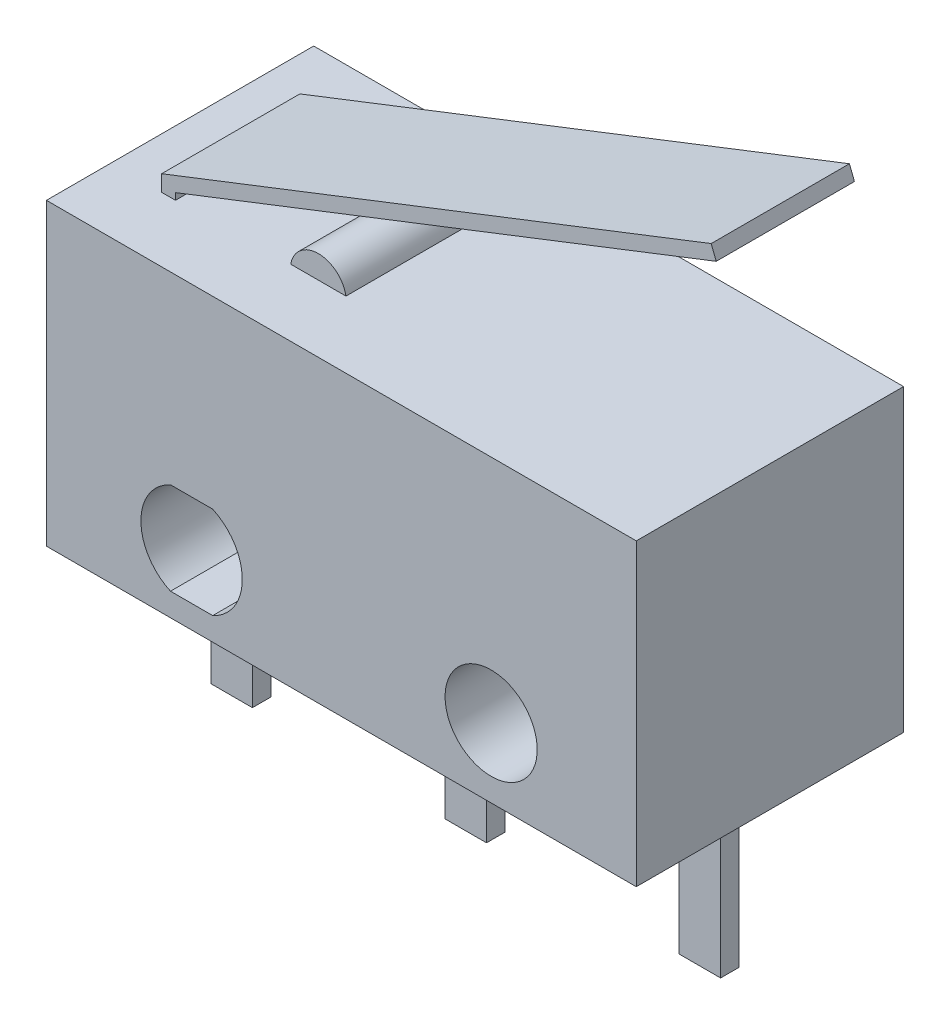
ISO-10303-21;
HEADER;
FILE_DESCRIPTION(('STEP AP214'),'2;1');
FILE_NAME('part.step','',(''),(''),'','','');
FILE_SCHEMA(('AUTOMOTIVE_DESIGN { 1 0 10303 214 1 1 1 1 }'));
ENDSEC;
DATA;
#1=APPLICATION_CONTEXT('core data for automotive mechanical design processes');
#2=APPLICATION_PROTOCOL_DEFINITION('international standard','automotive_design',2000,#1);
#3=PRODUCT_CONTEXT('',#1,'mechanical');
#4=PRODUCT('Part','Part','',(#3));
#5=PRODUCT_RELATED_PRODUCT_CATEGORY('part','',(#4));
#6=PRODUCT_DEFINITION_FORMATION('','',#4);
#7=PRODUCT_DEFINITION_CONTEXT('part definition',#1,'design');
#8=PRODUCT_DEFINITION('design','',#6,#7);
#9=PRODUCT_DEFINITION_SHAPE('','',#8);
#10=(LENGTH_UNIT() NAMED_UNIT(*) SI_UNIT(.MILLI.,.METRE.));
#11=(NAMED_UNIT(*) PLANE_ANGLE_UNIT() SI_UNIT($,.RADIAN.));
#12=(NAMED_UNIT(*) SI_UNIT($,.STERADIAN.) SOLID_ANGLE_UNIT());
#13=UNCERTAINTY_MEASURE_WITH_UNIT(LENGTH_MEASURE(1.E-05),#10,'distance_accuracy_value','');
#14=(GEOMETRIC_REPRESENTATION_CONTEXT(3) GLOBAL_UNCERTAINTY_ASSIGNED_CONTEXT((#13)) GLOBAL_UNIT_ASSIGNED_CONTEXT((#10,
#11,#12)) REPRESENTATION_CONTEXT('',''));
#15=CARTESIAN_POINT('',(0.,0.,0.));
#16=DIRECTION('',(0.,0.,1.));
#17=DIRECTION('',(1.,0.,0.));
#18=AXIS2_PLACEMENT_3D('',#15,#16,#17);
#19=CARTESIAN_POINT('',(6.4,3.25,0.));
#20=DIRECTION('',(-1.,0.,0.));
#21=DIRECTION('',(0.,0.,1.));
#22=AXIS2_PLACEMENT_3D('',#19,#20,#21);
#23=PLANE('',#22);
#24=DIRECTION('',(0.,0.,-1.));
#25=VECTOR('',#24,1.);
#26=CARTESIAN_POINT('',(6.4,0.,0.));
#27=LINE('',#26,#25);
#28=CARTESIAN_POINT('',(6.4,0.,2.9));
#29=VERTEX_POINT('',#28);
#30=CARTESIAN_POINT('',(6.4,0.,-2.9));
#31=VERTEX_POINT('',#30);
#32=EDGE_CURVE('E235',#29,#31,#27,.T.);
#33=ORIENTED_EDGE('',*,*,#32,.T.);
#34=DIRECTION('',(0.,-1.,0.));
#35=VECTOR('',#34,1.);
#36=CARTESIAN_POINT('',(6.4,3.25,-2.9));
#37=LINE('',#36,#35);
#38=CARTESIAN_POINT('',(6.4,6.5,-2.9));
#39=VERTEX_POINT('',#38);
#40=EDGE_CURVE('E231',#39,#31,#37,.T.);
#41=ORIENTED_EDGE('',*,*,#40,.F.);
#42=DIRECTION('',(0.,0.,-1.));
#43=VECTOR('',#42,1.);
#44=CARTESIAN_POINT('',(6.4,6.5,0.));
#45=LINE('',#44,#43);
#46=CARTESIAN_POINT('',(6.4,6.5,2.9));
#47=VERTEX_POINT('',#46);
#48=EDGE_CURVE('E9',#47,#39,#45,.T.);
#49=ORIENTED_EDGE('',*,*,#48,.F.);
#50=DIRECTION('',(0.,1.,0.));
#51=VECTOR('',#50,1.);
#52=CARTESIAN_POINT('',(6.4,3.25,2.9));
#53=LINE('',#52,#51);
#54=EDGE_CURVE('E223',#29,#47,#53,.T.);
#55=ORIENTED_EDGE('',*,*,#54,.F.);
#56=EDGE_LOOP('',(#33,#41,#49,#55));
#57=FACE_BOUND('',#56,.T.);
#58=ADVANCED_FACE('F15',(#57),#23,.F.);
#59=CARTESIAN_POINT('',(0.,6.5,0.));
#60=DIRECTION('',(0.,-1.,0.));
#61=DIRECTION('',(0.,0.,-1.));
#62=AXIS2_PLACEMENT_3D('',#59,#60,#61);
#63=PLANE('',#62);
#64=ORIENTED_EDGE('',*,*,#48,.T.);
#65=DIRECTION('',(1.,0.,0.));
#66=VECTOR('',#65,1.);
#67=CARTESIAN_POINT('',(0.,6.5,-2.9));
#68=LINE('',#67,#66);
#69=CARTESIAN_POINT('',(-6.4,6.5,-2.9));
#70=VERTEX_POINT('',#69);
#71=EDGE_CURVE('E236',#70,#39,#68,.T.);
#72=ORIENTED_EDGE('',*,*,#71,.F.);
#73=DIRECTION('',(0.,0.,-1.));
#74=VECTOR('',#73,1.);
#75=CARTESIAN_POINT('',(-6.4,6.5,0.));
#76=LINE('',#75,#74);
#77=CARTESIAN_POINT('',(-6.4,6.5,2.9));
#78=VERTEX_POINT('',#77);
#79=EDGE_CURVE('E25',#78,#70,#76,.T.);
#80=ORIENTED_EDGE('',*,*,#79,.F.);
#81=DIRECTION('',(-1.,0.,0.));
#82=VECTOR('',#81,1.);
#83=CARTESIAN_POINT('',(0.,6.5,2.9));
#84=LINE('',#83,#82);
#85=EDGE_CURVE('E226',#47,#78,#84,.T.);
#86=ORIENTED_EDGE('',*,*,#85,.F.);
#87=EDGE_LOOP('',(#64,#72,#80,#86));
#88=FACE_BOUND('',#87,.T.);
#89=DIRECTION('',(0.,0.,-1.));
#90=VECTOR('',#89,1.);
#91=CARTESIAN_POINT('',(-5.3000080715871,6.5,-0.75));
#92=LINE('',#91,#90);
#93=CARTESIAN_POINT('',(-5.3000080715871,6.5,1.5));
#94=VERTEX_POINT('',#93);
#95=CARTESIAN_POINT('',(-5.3000080715871,6.5,-1.5));
#96=VERTEX_POINT('',#95);
#97=EDGE_CURVE('E330',#94,#96,#92,.T.);
#98=ORIENTED_EDGE('',*,*,#97,.T.);
#99=DIRECTION('',(1.,0.,0.));
#100=VECTOR('',#99,1.);
#101=CARTESIAN_POINT('',(0.15945017554528,6.5,-1.5));
#102=LINE('',#101,#100);
#103=CARTESIAN_POINT('',(-5.00000406262541,6.5,-1.5));
#104=VERTEX_POINT('',#103);
#105=EDGE_CURVE('E285',#96,#104,#102,.T.);
#106=ORIENTED_EDGE('',*,*,#105,.T.);
#107=DIRECTION('',(0.,0.,1.));
#108=VECTOR('',#107,1.);
#109=CARTESIAN_POINT('',(-5.00000406262541,6.5,-0.75));
#110=LINE('',#109,#108);
#111=CARTESIAN_POINT('',(-5.00000406262541,6.5,1.5));
#112=VERTEX_POINT('',#111);
#113=EDGE_CURVE('E254',#104,#112,#110,.T.);
#114=ORIENTED_EDGE('',*,*,#113,.T.);
#115=DIRECTION('',(-1.,0.,0.));
#116=VECTOR('',#115,1.);
#117=CARTESIAN_POINT('',(0.15945017554528,6.5,1.5));
#118=LINE('',#117,#116);
#119=EDGE_CURVE('E355',#112,#94,#118,.T.);
#120=ORIENTED_EDGE('',*,*,#119,.T.);
#121=EDGE_LOOP('',(#98,#106,#114,#120));
#122=FACE_BOUND('',#121,.T.);
#123=DIRECTION('',(0.,0.,1.));
#124=VECTOR('',#123,1.);
#125=CARTESIAN_POINT('',(-1.35,6.5,0.));
#126=LINE('',#125,#124);
#127=CARTESIAN_POINT('',(-1.35,6.5,-1.45));
#128=VERTEX_POINT('',#127);
#129=CARTESIAN_POINT('',(-1.35,6.5,1.45));
#130=VERTEX_POINT('',#129);
#131=EDGE_CURVE('E296',#128,#130,#126,.T.);
#132=ORIENTED_EDGE('',*,*,#131,.T.);
#133=DIRECTION('',(-1.,0.,0.));
#134=VECTOR('',#133,1.);
#135=CARTESIAN_POINT('',(-0.975,6.5,1.45));
#136=LINE('',#135,#134);
#137=CARTESIAN_POINT('',(-2.55,6.5,1.45));
#138=VERTEX_POINT('',#137);
#139=EDGE_CURVE('E394',#130,#138,#136,.T.);
#140=ORIENTED_EDGE('',*,*,#139,.T.);
#141=DIRECTION('',(0.,0.,-1.));
#142=VECTOR('',#141,1.);
#143=CARTESIAN_POINT('',(-2.55,6.5,0.));
#144=LINE('',#143,#142);
#145=CARTESIAN_POINT('',(-2.55,6.5,-1.45));
#146=VERTEX_POINT('',#145);
#147=EDGE_CURVE('E293',#138,#146,#144,.T.);
#148=ORIENTED_EDGE('',*,*,#147,.T.);
#149=DIRECTION('',(1.,0.,0.));
#150=VECTOR('',#149,1.);
#151=CARTESIAN_POINT('',(-0.975,6.5,-1.45));
#152=LINE('',#151,#150);
#153=EDGE_CURVE('E262',#146,#128,#152,.T.);
#154=ORIENTED_EDGE('',*,*,#153,.T.);
#155=EDGE_LOOP('',(#132,#140,#148,#154));
#156=FACE_BOUND('',#155,.T.);
#157=ADVANCED_FACE('F414',(#88,#122,#156),#63,.F.);
#158=CARTESIAN_POINT('',(-6.4,3.25,0.));
#159=DIRECTION('',(1.,0.,0.));
#160=DIRECTION('',(0.,0.,-1.));
#161=AXIS2_PLACEMENT_3D('',#158,#159,#160);
#162=PLANE('',#161);
#163=ORIENTED_EDGE('',*,*,#79,.T.);
#164=DIRECTION('',(0.,1.,0.));
#165=VECTOR('',#164,1.);
#166=CARTESIAN_POINT('',(-6.4,3.25,-2.9));
#167=LINE('',#166,#165);
#168=CARTESIAN_POINT('',(-6.4,0.,-2.9));
#169=VERTEX_POINT('',#168);
#170=EDGE_CURVE('E273',#169,#70,#167,.T.);
#171=ORIENTED_EDGE('',*,*,#170,.F.);
#172=DIRECTION('',(0.,0.,-1.));
#173=VECTOR('',#172,1.);
#174=CARTESIAN_POINT('',(-6.4,0.,0.));
#175=LINE('',#174,#173);
#176=CARTESIAN_POINT('',(-6.4,0.,2.9));
#177=VERTEX_POINT('',#176);
#178=EDGE_CURVE('E233',#177,#169,#175,.T.);
#179=ORIENTED_EDGE('',*,*,#178,.F.);
#180=DIRECTION('',(0.,-1.,0.));
#181=VECTOR('',#180,1.);
#182=CARTESIAN_POINT('',(-6.4,3.25,2.9));
#183=LINE('',#182,#181);
#184=EDGE_CURVE('E232',#78,#177,#183,.T.);
#185=ORIENTED_EDGE('',*,*,#184,.F.);
#186=EDGE_LOOP('',(#163,#171,#179,#185));
#187=FACE_BOUND('',#186,.T.);
#188=ADVANCED_FACE('F507',(#187),#162,.F.);
#189=CARTESIAN_POINT('',(0.,0.,0.));
#190=DIRECTION('',(0.,1.,0.));
#191=DIRECTION('',(0.,0.,1.));
#192=AXIS2_PLACEMENT_3D('',#189,#190,#191);
#193=PLANE('',#192);
#194=ORIENTED_EDGE('',*,*,#178,.T.);
#195=DIRECTION('',(-1.,0.,0.));
#196=VECTOR('',#195,1.);
#197=CARTESIAN_POINT('',(0.,0.,-2.9));
#198=LINE('',#197,#196);
#199=EDGE_CURVE('E276',#31,#169,#198,.T.);
#200=ORIENTED_EDGE('',*,*,#199,.F.);
#201=ORIENTED_EDGE('',*,*,#32,.F.);
#202=DIRECTION('',(1.,0.,0.));
#203=VECTOR('',#202,1.);
#204=CARTESIAN_POINT('',(0.,0.,2.9));
#205=LINE('',#204,#203);
#206=EDGE_CURVE('E228',#177,#29,#205,.T.);
#207=ORIENTED_EDGE('',*,*,#206,.F.);
#208=EDGE_LOOP('',(#194,#200,#201,#207));
#209=FACE_BOUND('',#208,.T.);
#210=DIRECTION('',(-1.,0.,0.));
#211=VECTOR('',#210,1.);
#212=CARTESIAN_POINT('',(-2.54,0.,-0.2));
#213=LINE('',#212,#211);
#214=CARTESIAN_POINT('',(-4.63,0.,-0.2));
#215=VERTEX_POINT('',#214);
#216=CARTESIAN_POINT('',(-5.53,0.,-0.2));
#217=VERTEX_POINT('',#216);
#218=EDGE_CURVE('E202',#215,#217,#213,.T.);
#219=ORIENTED_EDGE('',*,*,#218,.T.);
#220=DIRECTION('',(0.,0.,1.));
#221=VECTOR('',#220,1.);
#222=CARTESIAN_POINT('',(-5.53,0.,0.));
#223=LINE('',#222,#221);
#224=CARTESIAN_POINT('',(-5.53,0.,0.2));
#225=VERTEX_POINT('',#224);
#226=EDGE_CURVE('E463',#217,#225,#223,.T.);
#227=ORIENTED_EDGE('',*,*,#226,.T.);
#228=DIRECTION('',(1.,0.,0.));
#229=VECTOR('',#228,1.);
#230=CARTESIAN_POINT('',(-2.54,0.,0.2));
#231=LINE('',#230,#229);
#232=CARTESIAN_POINT('',(-4.63,0.,0.2));
#233=VERTEX_POINT('',#232);
#234=EDGE_CURVE('E345',#225,#233,#231,.T.);
#235=ORIENTED_EDGE('',*,*,#234,.T.);
#236=DIRECTION('',(0.,0.,-1.));
#237=VECTOR('',#236,1.);
#238=CARTESIAN_POINT('',(-4.63,0.,0.));
#239=LINE('',#238,#237);
#240=EDGE_CURVE('E282',#233,#215,#239,.T.);
#241=ORIENTED_EDGE('',*,*,#240,.T.);
#242=EDGE_LOOP('',(#219,#227,#235,#241));
#243=FACE_BOUND('',#242,.T.);
#244=DIRECTION('',(-1.,0.,0.));
#245=VECTOR('',#244,1.);
#246=CARTESIAN_POINT('',(0.,0.,-0.2));
#247=LINE('',#246,#245);
#248=CARTESIAN_POINT('',(0.45,0.,-0.2));
#249=VERTEX_POINT('',#248);
#250=CARTESIAN_POINT('',(-0.45,0.,-0.2));
#251=VERTEX_POINT('',#250);
#252=EDGE_CURVE('E311',#249,#251,#247,.T.);
#253=ORIENTED_EDGE('',*,*,#252,.T.);
#254=DIRECTION('',(0.,0.,1.));
#255=VECTOR('',#254,1.);
#256=CARTESIAN_POINT('',(-0.45,0.,0.));
#257=LINE('',#256,#255);
#258=CARTESIAN_POINT('',(-0.45,0.,0.2));
#259=VERTEX_POINT('',#258);
#260=EDGE_CURVE('E217',#251,#259,#257,.T.);
#261=ORIENTED_EDGE('',*,*,#260,.T.);
#262=DIRECTION('',(1.,0.,0.));
#263=VECTOR('',#262,1.);
#264=CARTESIAN_POINT('',(0.,0.,0.2));
#265=LINE('',#264,#263);
#266=CARTESIAN_POINT('',(0.45,0.,0.2));
#267=VERTEX_POINT('',#266);
#268=EDGE_CURVE('E314',#259,#267,#265,.T.);
#269=ORIENTED_EDGE('',*,*,#268,.T.);
#270=DIRECTION('',(0.,0.,-1.));
#271=VECTOR('',#270,1.);
#272=CARTESIAN_POINT('',(0.45,0.,0.));
#273=LINE('',#272,#271);
#274=EDGE_CURVE('E19',#267,#249,#273,.T.);
#275=ORIENTED_EDGE('',*,*,#274,.T.);
#276=EDGE_LOOP('',(#253,#261,#269,#275));
#277=FACE_BOUND('',#276,.T.);
#278=DIRECTION('',(-1.,0.,0.));
#279=VECTOR('',#278,1.);
#280=CARTESIAN_POINT('',(2.54,0.,-0.2));
#281=LINE('',#280,#279);
#282=CARTESIAN_POINT('',(5.53,0.,-0.2));
#283=VERTEX_POINT('',#282);
#284=CARTESIAN_POINT('',(4.63,0.,-0.2));
#285=VERTEX_POINT('',#284);
#286=EDGE_CURVE('E195',#283,#285,#281,.T.);
#287=ORIENTED_EDGE('',*,*,#286,.T.);
#288=DIRECTION('',(0.,0.,1.));
#289=VECTOR('',#288,1.);
#290=CARTESIAN_POINT('',(4.63,0.,0.));
#291=LINE('',#290,#289);
#292=CARTESIAN_POINT('',(4.63,0.,0.2));
#293=VERTEX_POINT('',#292);
#294=EDGE_CURVE('E264',#285,#293,#291,.T.);
#295=ORIENTED_EDGE('',*,*,#294,.T.);
#296=DIRECTION('',(1.,0.,0.));
#297=VECTOR('',#296,1.);
#298=CARTESIAN_POINT('',(2.54,0.,0.2));
#299=LINE('',#298,#297);
#300=CARTESIAN_POINT('',(5.53,0.,0.2));
#301=VERTEX_POINT('',#300);
#302=EDGE_CURVE('E192',#293,#301,#299,.T.);
#303=ORIENTED_EDGE('',*,*,#302,.T.);
#304=DIRECTION('',(0.,0.,-1.));
#305=VECTOR('',#304,1.);
#306=CARTESIAN_POINT('',(5.53,0.,0.));
#307=LINE('',#306,#305);
#308=EDGE_CURVE('E182',#301,#283,#307,.T.);
#309=ORIENTED_EDGE('',*,*,#308,.T.);
#310=EDGE_LOOP('',(#287,#295,#303,#309));
#311=FACE_BOUND('',#310,.T.);
#312=ADVANCED_FACE('F447',(#209,#243,#277,#311),#193,.F.);
#313=CARTESIAN_POINT('',(0.,3.25,-2.9));
#314=DIRECTION('',(0.,0.,1.));
#315=DIRECTION('',(1.,0.,0.));
#316=AXIS2_PLACEMENT_3D('',#313,#314,#315);
#317=PLANE('',#316);
#318=ORIENTED_EDGE('',*,*,#40,.T.);
#319=ORIENTED_EDGE('',*,*,#199,.T.);
#320=ORIENTED_EDGE('',*,*,#170,.T.);
#321=ORIENTED_EDGE('',*,*,#71,.T.);
#322=EDGE_LOOP('',(#318,#319,#320,#321));
#323=FACE_BOUND('',#322,.T.);
#324=CARTESIAN_POINT('',(3.25,1.5,-2.9));
#325=DIRECTION('',(0.,0.,1.));
#326=DIRECTION('',(1.,0.,0.));
#327=AXIS2_PLACEMENT_3D('',#324,#325,#326);
#328=CIRCLE('',#327,1.);
#329=CARTESIAN_POINT('',(2.25,1.5,-2.9));
#330=VERTEX_POINT('',#329);
#331=EDGE_CURVE('E343',#330,#330,#328,.T.);
#332=ORIENTED_EDGE('',*,*,#331,.T.);
#333=EDGE_LOOP('',(#332));
#334=FACE_BOUND('',#333,.T.);
#335=DIRECTION('',(-1.,0.,0.));
#336=VECTOR('',#335,1.);
#337=CARTESIAN_POINT('',(-1.25,2.5,-2.9));
#338=LINE('',#337,#336);
#339=CARTESIAN_POINT('',(-2.79174243050441,2.5,-2.9));
#340=VERTEX_POINT('',#339);
#341=CARTESIAN_POINT('',(-3.70825756949558,2.5,-2.9));
#342=VERTEX_POINT('',#341);
#343=EDGE_CURVE('E303',#340,#342,#338,.T.);
#344=ORIENTED_EDGE('',*,*,#343,.T.);
#345=CARTESIAN_POINT('',(-3.25,1.5,-2.9));
#346=DIRECTION('',(0.,0.,1.));
#347=DIRECTION('',(1.,0.,0.));
#348=AXIS2_PLACEMENT_3D('',#345,#346,#347);
#349=CIRCLE('',#348,1.1);
#350=CARTESIAN_POINT('',(-3.70825756949558,0.5,-2.9));
#351=VERTEX_POINT('',#350);
#352=EDGE_CURVE('E268',#342,#351,#349,.T.);
#353=ORIENTED_EDGE('',*,*,#352,.T.);
#354=DIRECTION('',(1.,0.,0.));
#355=VECTOR('',#354,1.);
#356=CARTESIAN_POINT('',(-1.25,0.5,-2.9));
#357=LINE('',#356,#355);
#358=CARTESIAN_POINT('',(-2.79174243050441,0.5,-2.9));
#359=VERTEX_POINT('',#358);
#360=EDGE_CURVE('E221',#351,#359,#357,.T.);
#361=ORIENTED_EDGE('',*,*,#360,.T.);
#362=CARTESIAN_POINT('',(-3.25,1.5,-2.9));
#363=DIRECTION('',(0.,0.,1.));
#364=DIRECTION('',(1.,0.,0.));
#365=AXIS2_PLACEMENT_3D('',#362,#363,#364);
#366=CIRCLE('',#365,1.1);
#367=EDGE_CURVE('E257',#359,#340,#366,.T.);
#368=ORIENTED_EDGE('',*,*,#367,.T.);
#369=EDGE_LOOP('',(#344,#353,#361,#368));
#370=FACE_BOUND('',#369,.T.);
#371=ADVANCED_FACE('F384',(#323,#334,#370),#317,.F.);
#372=CARTESIAN_POINT('',(0.,3.25,2.9));
#373=DIRECTION('',(0.,0.,1.));
#374=DIRECTION('',(1.,0.,0.));
#375=AXIS2_PLACEMENT_3D('',#372,#373,#374);
#376=PLANE('',#375);
#377=ORIENTED_EDGE('',*,*,#54,.T.);
#378=ORIENTED_EDGE('',*,*,#85,.T.);
#379=ORIENTED_EDGE('',*,*,#184,.T.);
#380=ORIENTED_EDGE('',*,*,#206,.T.);
#381=EDGE_LOOP('',(#377,#378,#379,#380));
#382=FACE_BOUND('',#381,.T.);
#383=CARTESIAN_POINT('',(3.25,1.5,2.9));
#384=DIRECTION('',(0.,0.,-1.));
#385=DIRECTION('',(1.,0.,0.));
#386=AXIS2_PLACEMENT_3D('',#383,#384,#385);
#387=CIRCLE('',#386,1.);
#388=CARTESIAN_POINT('',(2.25,1.5,2.9));
#389=VERTEX_POINT('',#388);
#390=EDGE_CURVE('E227',#389,#389,#387,.T.);
#391=ORIENTED_EDGE('',*,*,#390,.T.);
#392=EDGE_LOOP('',(#391));
#393=FACE_BOUND('',#392,.T.);
#394=DIRECTION('',(1.,0.,0.));
#395=VECTOR('',#394,1.);
#396=CARTESIAN_POINT('',(-1.25,2.5,2.9));
#397=LINE('',#396,#395);
#398=CARTESIAN_POINT('',(-3.70825756949558,2.5,2.9));
#399=VERTEX_POINT('',#398);
#400=CARTESIAN_POINT('',(-2.79174243050441,2.5,2.9));
#401=VERTEX_POINT('',#400);
#402=EDGE_CURVE('E305',#399,#401,#397,.T.);
#403=ORIENTED_EDGE('',*,*,#402,.T.);
#404=CARTESIAN_POINT('',(-3.25,1.5,2.9));
#405=DIRECTION('',(0.,0.,-1.));
#406=DIRECTION('',(1.,0.,0.));
#407=AXIS2_PLACEMENT_3D('',#404,#405,#406);
#408=CIRCLE('',#407,1.1);
#409=CARTESIAN_POINT('',(-2.79174243050441,0.5,2.9));
#410=VERTEX_POINT('',#409);
#411=EDGE_CURVE('E255',#401,#410,#408,.T.);
#412=ORIENTED_EDGE('',*,*,#411,.T.);
#413=DIRECTION('',(-1.,0.,0.));
#414=VECTOR('',#413,1.);
#415=CARTESIAN_POINT('',(-1.25,0.5,2.9));
#416=LINE('',#415,#414);
#417=CARTESIAN_POINT('',(-3.70825756949558,0.5,2.9));
#418=VERTEX_POINT('',#417);
#419=EDGE_CURVE('E222',#410,#418,#416,.T.);
#420=ORIENTED_EDGE('',*,*,#419,.T.);
#421=CARTESIAN_POINT('',(-3.25,1.5,2.9));
#422=DIRECTION('',(0.,0.,-1.));
#423=DIRECTION('',(1.,0.,0.));
#424=AXIS2_PLACEMENT_3D('',#421,#422,#423);
#425=CIRCLE('',#424,1.1);
#426=EDGE_CURVE('E272',#418,#399,#425,.T.);
#427=ORIENTED_EDGE('',*,*,#426,.T.);
#428=EDGE_LOOP('',(#403,#412,#420,#427));
#429=FACE_BOUND('',#428,.T.);
#430=ADVANCED_FACE('F541',(#382,#393,#429),#376,.T.);
#431=CARTESIAN_POINT('',(3.25,1.5,0.));
#432=DIRECTION('',(0.,0.,-1.));
#433=DIRECTION('',(1.,0.,0.));
#434=AXIS2_PLACEMENT_3D('',#431,#432,#433);
#435=CYLINDRICAL_SURFACE('',#434,1.);
#436=ORIENTED_EDGE('',*,*,#390,.F.);
#437=EDGE_LOOP('',(#436));
#438=FACE_BOUND('',#437,.T.);
#439=ORIENTED_EDGE('',*,*,#331,.F.);
#440=EDGE_LOOP('',(#439));
#441=FACE_BOUND('',#440,.T.);
#442=ADVANCED_FACE('F526',(#438,#441),#435,.F.);
#443=CARTESIAN_POINT('',(-3.25,1.5,0.));
#444=DIRECTION('',(0.,0.,-1.));
#445=DIRECTION('',(1.,0.,0.));
#446=AXIS2_PLACEMENT_3D('',#443,#444,#445);
#447=CYLINDRICAL_SURFACE('',#446,1.1);
#448=ORIENTED_EDGE('',*,*,#411,.F.);
#449=DIRECTION('',(0.,0.,-1.));
#450=VECTOR('',#449,1.);
#451=CARTESIAN_POINT('',(-2.79174243050441,2.5,0.));
#452=LINE('',#451,#450);
#453=EDGE_CURVE('E258',#401,#340,#452,.T.);
#454=ORIENTED_EDGE('',*,*,#453,.T.);
#455=ORIENTED_EDGE('',*,*,#367,.F.);
#456=DIRECTION('',(0.,0.,1.));
#457=VECTOR('',#456,1.);
#458=CARTESIAN_POINT('',(-2.79174243050441,0.5,0.));
#459=LINE('',#458,#457);
#460=EDGE_CURVE('E218',#359,#410,#459,.T.);
#461=ORIENTED_EDGE('',*,*,#460,.T.);
#462=EDGE_LOOP('',(#448,#454,#455,#461));
#463=FACE_BOUND('',#462,.T.);
#464=ADVANCED_FACE('F377',(#463),#447,.F.);
#465=CARTESIAN_POINT('',(-2.5,2.5,0.));
#466=DIRECTION('',(0.,-1.,0.));
#467=DIRECTION('',(0.,0.,-1.));
#468=AXIS2_PLACEMENT_3D('',#465,#466,#467);
#469=PLANE('',#468);
#470=ORIENTED_EDGE('',*,*,#402,.F.);
#471=DIRECTION('',(0.,0.,1.));
#472=VECTOR('',#471,1.);
#473=CARTESIAN_POINT('',(-3.70825756949558,2.5,0.));
#474=LINE('',#473,#472);
#475=EDGE_CURVE('E271',#342,#399,#474,.T.);
#476=ORIENTED_EDGE('',*,*,#475,.F.);
#477=ORIENTED_EDGE('',*,*,#343,.F.);
#478=ORIENTED_EDGE('',*,*,#453,.F.);
#479=EDGE_LOOP('',(#470,#476,#477,#478));
#480=FACE_BOUND('',#479,.T.);
#481=ADVANCED_FACE('F381',(#480),#469,.T.);
#482=CARTESIAN_POINT('',(-3.25,1.5,0.));
#483=DIRECTION('',(0.,0.,-1.));
#484=DIRECTION('',(1.,0.,0.));
#485=AXIS2_PLACEMENT_3D('',#482,#483,#484);
#486=CYLINDRICAL_SURFACE('',#485,1.1);
#487=ORIENTED_EDGE('',*,*,#426,.F.);
#488=DIRECTION('',(0.,0.,-1.));
#489=VECTOR('',#488,1.);
#490=CARTESIAN_POINT('',(-3.70825756949558,0.5,0.));
#491=LINE('',#490,#489);
#492=EDGE_CURVE('E326',#418,#351,#491,.T.);
#493=ORIENTED_EDGE('',*,*,#492,.T.);
#494=ORIENTED_EDGE('',*,*,#352,.F.);
#495=ORIENTED_EDGE('',*,*,#475,.T.);
#496=EDGE_LOOP('',(#487,#493,#494,#495));
#497=FACE_BOUND('',#496,.T.);
#498=ADVANCED_FACE('F573',(#497),#486,.F.);
#499=CARTESIAN_POINT('',(-2.5,0.5,0.));
#500=DIRECTION('',(0.,1.,0.));
#501=DIRECTION('',(0.,0.,1.));
#502=AXIS2_PLACEMENT_3D('',#499,#500,#501);
#503=PLANE('',#502);
#504=ORIENTED_EDGE('',*,*,#419,.F.);
#505=ORIENTED_EDGE('',*,*,#460,.F.);
#506=ORIENTED_EDGE('',*,*,#360,.F.);
#507=ORIENTED_EDGE('',*,*,#492,.F.);
#508=EDGE_LOOP('',(#504,#505,#506,#507));
#509=FACE_BOUND('',#508,.T.);
#510=ADVANCED_FACE('F571',(#509),#503,.T.);
#511=CARTESIAN_POINT('',(0.31890035109056,8.83100159039961,1.5));
#512=DIRECTION('',(0.,0.,1.));
#513=DIRECTION('',(1.,0.,0.));
#514=AXIS2_PLACEMENT_3D('',#511,#512,#513);
#515=PLANE('',#514);
#516=ORIENTED_EDGE('',*,*,#119,.F.);
#517=DIRECTION('',(5.0282527014689E-06,-0.999999999987358,0.));
#518=VECTOR('',#517,1.);
#519=CARTESIAN_POINT('',(-5.00000479157131,6.64497002303335,1.5));
#520=LINE('',#519,#518);
#521=CARTESIAN_POINT('',(-5.00000479157131,6.64497002303335,1.5));
#522=VERTEX_POINT('',#521);
#523=EDGE_CURVE('E253',#522,#112,#520,.T.);
#524=ORIENTED_EDGE('',*,*,#523,.F.);
#525=DIRECTION('',(-0.931679220841708,-0.363282024674752,0.));
#526=VECTOR('',#525,1.);
#527=CARTESIAN_POINT('',(-5.00000479157131,6.64497002303335,1.5));
#528=LINE('',#527,#526);
#529=CARTESIAN_POINT('',(6.73446706608689,11.2204962337475,1.5));
#530=VERTEX_POINT('',#529);
#531=EDGE_CURVE('E357',#530,#522,#528,.T.);
#532=ORIENTED_EDGE('',*,*,#531,.F.);
#533=DIRECTION('',(0.363282024674744,-0.931679220841711,0.));
#534=VECTOR('',#533,1.);
#535=CARTESIAN_POINT('',(6.73446706608689,11.2204962337475,1.5));
#536=LINE('',#535,#534);
#537=CARTESIAN_POINT('',(6.62548245868447,11.5,1.5));
#538=VERTEX_POINT('',#537);
#539=EDGE_CURVE('E298',#538,#530,#536,.T.);
#540=ORIENTED_EDGE('',*,*,#539,.F.);
#541=DIRECTION('',(0.931679220841709,0.36328202467475,0.));
#542=VECTOR('',#541,1.);
#543=CARTESIAN_POINT('',(-5.30001156808936,6.84999008416321,1.5));
#544=LINE('',#543,#542);
#545=CARTESIAN_POINT('',(-5.30001156808936,6.84999008416321,1.5));
#546=VERTEX_POINT('',#545);
#547=EDGE_CURVE('E261',#546,#538,#544,.T.);
#548=ORIENTED_EDGE('',*,*,#547,.F.);
#549=DIRECTION('',(-9.99028949325345E-06,0.999999999950097,0.));
#550=VECTOR('',#549,1.);
#551=CARTESIAN_POINT('',(-5.30001156808936,6.84999008416321,1.5));
#552=LINE('',#551,#550);
#553=EDGE_CURVE('E292',#94,#546,#552,.T.);
#554=ORIENTED_EDGE('',*,*,#553,.F.);
#555=EDGE_LOOP('',(#516,#524,#532,#540,#548,#554));
#556=FACE_BOUND('',#555,.T.);
#557=ADVANCED_FACE('F426',(#556),#515,.T.);
#558=CARTESIAN_POINT('',(0.867231137257791,8.93273312839043,-1.5));
#559=DIRECTION('',(0.363282024674752,-0.931679220841709,0.));
#560=DIRECTION('',(0.931679220841709,0.363282024674752,0.));
#561=AXIS2_PLACEMENT_3D('',#558,#559,#560);
#562=PLANE('',#561);
#563=ORIENTED_EDGE('',*,*,#531,.T.);
#564=DIRECTION('',(0.,0.,1.));
#565=VECTOR('',#564,1.);
#566=CARTESIAN_POINT('',(-5.00000479157131,6.64497002303335,-1.5));
#567=LINE('',#566,#565);
#568=CARTESIAN_POINT('',(-5.00000479157131,6.64497002303335,-1.5));
#569=VERTEX_POINT('',#568);
#570=EDGE_CURVE('E250',#569,#522,#567,.T.);
#571=ORIENTED_EDGE('',*,*,#570,.F.);
#572=DIRECTION('',(0.931679220841708,0.363282024674752,0.));
#573=VECTOR('',#572,1.);
#574=CARTESIAN_POINT('',(-5.00000479157131,6.64497002303335,-1.5));
#575=LINE('',#574,#573);
#576=CARTESIAN_POINT('',(6.73446706608689,11.2204962337475,-1.5));
#577=VERTEX_POINT('',#576);
#578=EDGE_CURVE('E320',#569,#577,#575,.T.);
#579=ORIENTED_EDGE('',*,*,#578,.T.);
#580=DIRECTION('',(0.,0.,1.));
#581=VECTOR('',#580,1.);
#582=CARTESIAN_POINT('',(6.73446706608689,11.2204962337475,-1.5));
#583=LINE('',#582,#581);
#584=EDGE_CURVE('E301',#577,#530,#583,.T.);
#585=ORIENTED_EDGE('',*,*,#584,.T.);
#586=EDGE_LOOP('',(#563,#571,#579,#585));
#587=FACE_BOUND('',#586,.T.);
#588=ADVANCED_FACE('F569',(#587),#562,.T.);
#589=CARTESIAN_POINT('',(6.67997476238568,11.3602481168737,-1.5));
#590=DIRECTION('',(0.931679220841711,0.363282024674744,0.));
#591=DIRECTION('',(-0.363282024674744,0.931679220841711,0.));
#592=AXIS2_PLACEMENT_3D('',#589,#590,#591);
#593=PLANE('',#592);
#594=ORIENTED_EDGE('',*,*,#539,.T.);
#595=ORIENTED_EDGE('',*,*,#584,.F.);
#596=DIRECTION('',(-0.363282024674744,0.931679220841711,0.));
#597=VECTOR('',#596,1.);
#598=CARTESIAN_POINT('',(6.73446706608689,11.2204962337475,-1.5));
#599=LINE('',#598,#597);
#600=CARTESIAN_POINT('',(6.62548245868447,11.5,-1.5));
#601=VERTEX_POINT('',#600);
#602=EDGE_CURVE('E240',#577,#601,#599,.T.);
#603=ORIENTED_EDGE('',*,*,#602,.T.);
#604=DIRECTION('',(0.,0.,1.));
#605=VECTOR('',#604,1.);
#606=CARTESIAN_POINT('',(6.62548245868447,11.5,-1.5));
#607=LINE('',#606,#605);
#608=EDGE_CURVE('E302',#601,#538,#607,.T.);
#609=ORIENTED_EDGE('',*,*,#608,.T.);
#610=EDGE_LOOP('',(#594,#595,#603,#609));
#611=FACE_BOUND('',#610,.T.);
#612=ADVANCED_FACE('F516',(#611),#593,.T.);
#613=CARTESIAN_POINT('',(0.662735445297558,9.17499504208161,-1.5));
#614=DIRECTION('',(-0.36328202467475,0.931679220841709,0.));
#615=DIRECTION('',(-0.931679220841709,-0.36328202467475,0.));
#616=AXIS2_PLACEMENT_3D('',#613,#614,#615);
#617=PLANE('',#616);
#618=ORIENTED_EDGE('',*,*,#547,.T.);
#619=ORIENTED_EDGE('',*,*,#608,.F.);
#620=DIRECTION('',(0.931679220841709,0.36328202467475,0.));
#621=VECTOR('',#620,1.);
#622=CARTESIAN_POINT('',(-5.30001156808936,6.84999008416321,-1.5));
#623=LINE('',#622,#621);
#624=CARTESIAN_POINT('',(-5.30001156808936,6.84999008416321,-1.5));
#625=VERTEX_POINT('',#624);
#626=EDGE_CURVE('E237',#625,#601,#623,.T.);
#627=ORIENTED_EDGE('',*,*,#626,.F.);
#628=DIRECTION('',(0.,0.,1.));
#629=VECTOR('',#628,1.);
#630=CARTESIAN_POINT('',(-5.30001156808936,6.84999008416321,-1.5));
#631=LINE('',#630,#629);
#632=EDGE_CURVE('E289',#625,#546,#631,.T.);
#633=ORIENTED_EDGE('',*,*,#632,.T.);
#634=EDGE_LOOP('',(#618,#619,#627,#633));
#635=FACE_BOUND('',#634,.T.);
#636=ADVANCED_FACE('F513',(#635),#617,.T.);
#637=CARTESIAN_POINT('',(-5.00000239578569,6.16850518111711,-1.5));
#638=DIRECTION('',(0.999999999987358,5.0282527014689E-06,0.));
#639=DIRECTION('',(-5.0282527014689E-06,0.999999999987358,0.));
#640=AXIS2_PLACEMENT_3D('',#637,#638,#639);
#641=PLANE('',#640);
#642=ORIENTED_EDGE('',*,*,#113,.F.);
#643=DIRECTION('',(5.0282527014689E-06,-0.999999999987358,0.));
#644=VECTOR('',#643,1.);
#645=CARTESIAN_POINT('',(-5.00000479157131,6.64497002303335,-1.5));
#646=LINE('',#645,#644);
#647=EDGE_CURVE('E323',#569,#104,#646,.T.);
#648=ORIENTED_EDGE('',*,*,#647,.F.);
#649=ORIENTED_EDGE('',*,*,#570,.T.);
#650=ORIENTED_EDGE('',*,*,#523,.T.);
#651=EDGE_LOOP('',(#642,#648,#649,#650));
#652=FACE_BOUND('',#651,.T.);
#653=ADVANCED_FACE('F423',(#652),#641,.T.);
#654=CARTESIAN_POINT('',(-5.30000578396277,6.27101521168204,-1.5));
#655=DIRECTION('',(-0.999999999950097,-9.99028949325345E-06,0.));
#656=DIRECTION('',(9.99028949325345E-06,-0.999999999950097,0.));
#657=AXIS2_PLACEMENT_3D('',#654,#655,#656);
#658=PLANE('',#657);
#659=ORIENTED_EDGE('',*,*,#97,.F.);
#660=ORIENTED_EDGE('',*,*,#553,.T.);
#661=ORIENTED_EDGE('',*,*,#632,.F.);
#662=DIRECTION('',(9.99028949325345E-06,-0.999999999950097,0.));
#663=VECTOR('',#662,1.);
#664=CARTESIAN_POINT('',(-5.30001156808936,6.84999008416321,-1.5));
#665=LINE('',#664,#663);
#666=EDGE_CURVE('E241',#625,#96,#665,.T.);
#667=ORIENTED_EDGE('',*,*,#666,.T.);
#668=EDGE_LOOP('',(#659,#660,#661,#667));
#669=FACE_BOUND('',#668,.T.);
#670=ADVANCED_FACE('F518',(#669),#658,.T.);
#671=CARTESIAN_POINT('',(0.31890035109056,8.83100159039961,-1.5));
#672=DIRECTION('',(0.,0.,1.));
#673=DIRECTION('',(1.,0.,0.));
#674=AXIS2_PLACEMENT_3D('',#671,#672,#673);
#675=PLANE('',#674);
#676=ORIENTED_EDGE('',*,*,#105,.F.);
#677=ORIENTED_EDGE('',*,*,#666,.F.);
#678=ORIENTED_EDGE('',*,*,#626,.T.);
#679=ORIENTED_EDGE('',*,*,#602,.F.);
#680=ORIENTED_EDGE('',*,*,#578,.F.);
#681=ORIENTED_EDGE('',*,*,#647,.T.);
#682=EDGE_LOOP('',(#676,#677,#678,#679,#680,#681));
#683=FACE_BOUND('',#682,.T.);
#684=ADVANCED_FACE('F17',(#683),#675,.F.);
#685=CARTESIAN_POINT('',(-4.63,-1.5,0.));
#686=DIRECTION('',(-1.,0.,0.));
#687=DIRECTION('',(0.,0.,1.));
#688=AXIS2_PLACEMENT_3D('',#685,#686,#687);
#689=PLANE('',#688);
#690=ORIENTED_EDGE('',*,*,#240,.F.);
#691=DIRECTION('',(0.,1.,0.));
#692=VECTOR('',#691,1.);
#693=CARTESIAN_POINT('',(-4.63,-1.5,0.2));
#694=LINE('',#693,#692);
#695=CARTESIAN_POINT('',(-4.63,-3.5,0.2));
#696=VERTEX_POINT('',#695);
#697=EDGE_CURVE('E245',#696,#233,#694,.T.);
#698=ORIENTED_EDGE('',*,*,#697,.F.);
#699=DIRECTION('',(0.,0.,-1.));
#700=VECTOR('',#699,1.);
#701=CARTESIAN_POINT('',(-4.63,-3.5,0.));
#702=LINE('',#701,#700);
#703=CARTESIAN_POINT('',(-4.63,-3.5,-0.2));
#704=VERTEX_POINT('',#703);
#705=EDGE_CURVE('E248',#696,#704,#702,.T.);
#706=ORIENTED_EDGE('',*,*,#705,.T.);
#707=DIRECTION('',(0.,-1.,0.));
#708=VECTOR('',#707,1.);
#709=CARTESIAN_POINT('',(-4.63,-1.5,-0.2));
#710=LINE('',#709,#708);
#711=EDGE_CURVE('E205',#215,#704,#710,.T.);
#712=ORIENTED_EDGE('',*,*,#711,.F.);
#713=EDGE_LOOP('',(#690,#698,#706,#712));
#714=FACE_BOUND('',#713,.T.);
#715=ADVANCED_FACE('F455',(#714),#689,.F.);
#716=CARTESIAN_POINT('',(-5.08,-3.5,0.));
#717=DIRECTION('',(0.,1.,0.));
#718=DIRECTION('',(0.,0.,1.));
#719=AXIS2_PLACEMENT_3D('',#716,#717,#718);
#720=PLANE('',#719);
#721=DIRECTION('',(0.,0.,-1.));
#722=VECTOR('',#721,1.);
#723=CARTESIAN_POINT('',(-5.53,-3.5,0.));
#724=LINE('',#723,#722);
#725=CARTESIAN_POINT('',(-5.53,-3.5,0.2));
#726=VERTEX_POINT('',#725);
#727=CARTESIAN_POINT('',(-5.53,-3.5,-0.2));
#728=VERTEX_POINT('',#727);
#729=EDGE_CURVE('E212',#726,#728,#724,.T.);
#730=ORIENTED_EDGE('',*,*,#729,.T.);
#731=DIRECTION('',(-1.,0.,0.));
#732=VECTOR('',#731,1.);
#733=CARTESIAN_POINT('',(-5.08,-3.5,-0.2));
#734=LINE('',#733,#732);
#735=EDGE_CURVE('E244',#704,#728,#734,.T.);
#736=ORIENTED_EDGE('',*,*,#735,.F.);
#737=ORIENTED_EDGE('',*,*,#705,.F.);
#738=DIRECTION('',(1.,0.,0.));
#739=VECTOR('',#738,1.);
#740=CARTESIAN_POINT('',(-5.08,-3.5,0.2));
#741=LINE('',#740,#739);
#742=EDGE_CURVE('E249',#726,#696,#741,.T.);
#743=ORIENTED_EDGE('',*,*,#742,.F.);
#744=EDGE_LOOP('',(#730,#736,#737,#743));
#745=FACE_BOUND('',#744,.T.);
#746=ADVANCED_FACE('F537',(#745),#720,.F.);
#747=CARTESIAN_POINT('',(-5.08,-1.5,0.2));
#748=DIRECTION('',(0.,0.,1.));
#749=DIRECTION('',(1.,0.,0.));
#750=AXIS2_PLACEMENT_3D('',#747,#748,#749);
#751=PLANE('',#750);
#752=ORIENTED_EDGE('',*,*,#234,.F.);
#753=DIRECTION('',(0.,-1.,0.));
#754=VECTOR('',#753,1.);
#755=CARTESIAN_POINT('',(-5.53,-1.5,0.2));
#756=LINE('',#755,#754);
#757=EDGE_CURVE('E206',#225,#726,#756,.T.);
#758=ORIENTED_EDGE('',*,*,#757,.T.);
#759=ORIENTED_EDGE('',*,*,#742,.T.);
#760=ORIENTED_EDGE('',*,*,#697,.T.);
#761=EDGE_LOOP('',(#752,#758,#759,#760));
#762=FACE_BOUND('',#761,.T.);
#763=ADVANCED_FACE('F534',(#762),#751,.T.);
#764=CARTESIAN_POINT('',(-5.08,-1.5,-0.2));
#765=DIRECTION('',(0.,0.,1.));
#766=DIRECTION('',(1.,0.,0.));
#767=AXIS2_PLACEMENT_3D('',#764,#765,#766);
#768=PLANE('',#767);
#769=ORIENTED_EDGE('',*,*,#218,.F.);
#770=ORIENTED_EDGE('',*,*,#711,.T.);
#771=ORIENTED_EDGE('',*,*,#735,.T.);
#772=DIRECTION('',(0.,1.,0.));
#773=VECTOR('',#772,1.);
#774=CARTESIAN_POINT('',(-5.53,-1.5,-0.2));
#775=LINE('',#774,#773);
#776=EDGE_CURVE('E288',#728,#217,#775,.T.);
#777=ORIENTED_EDGE('',*,*,#776,.T.);
#778=EDGE_LOOP('',(#769,#770,#771,#777));
#779=FACE_BOUND('',#778,.T.);
#780=ADVANCED_FACE('F458',(#779),#768,.F.);
#781=CARTESIAN_POINT('',(-5.53,-1.5,0.));
#782=DIRECTION('',(1.,0.,0.));
#783=DIRECTION('',(0.,0.,-1.));
#784=AXIS2_PLACEMENT_3D('',#781,#782,#783);
#785=PLANE('',#784);
#786=ORIENTED_EDGE('',*,*,#226,.F.);
#787=ORIENTED_EDGE('',*,*,#776,.F.);
#788=ORIENTED_EDGE('',*,*,#729,.F.);
#789=ORIENTED_EDGE('',*,*,#757,.F.);
#790=EDGE_LOOP('',(#786,#787,#788,#789));
#791=FACE_BOUND('',#790,.T.);
#792=ADVANCED_FACE('F466',(#791),#785,.F.);
#793=CARTESIAN_POINT('',(0.45,-1.5,0.));
#794=DIRECTION('',(-1.,0.,0.));
#795=DIRECTION('',(0.,0.,1.));
#796=AXIS2_PLACEMENT_3D('',#793,#794,#795);
#797=PLANE('',#796);
#798=ORIENTED_EDGE('',*,*,#274,.F.);
#799=DIRECTION('',(0.,1.,0.));
#800=VECTOR('',#799,1.);
#801=CARTESIAN_POINT('',(0.45,-1.5,0.2));
#802=LINE('',#801,#800);
#803=CARTESIAN_POINT('',(0.45,-3.5,0.2));
#804=VERTEX_POINT('',#803);
#805=EDGE_CURVE('E277',#804,#267,#802,.T.);
#806=ORIENTED_EDGE('',*,*,#805,.F.);
#807=DIRECTION('',(0.,0.,-1.));
#808=VECTOR('',#807,1.);
#809=CARTESIAN_POINT('',(0.45,-3.5,0.));
#810=LINE('',#809,#808);
#811=CARTESIAN_POINT('',(0.45,-3.5,-0.2));
#812=VERTEX_POINT('',#811);
#813=EDGE_CURVE('E280',#804,#812,#810,.T.);
#814=ORIENTED_EDGE('',*,*,#813,.T.);
#815=DIRECTION('',(0.,-1.,0.));
#816=VECTOR('',#815,1.);
#817=CARTESIAN_POINT('',(0.45,-1.5,-0.2));
#818=LINE('',#817,#816);
#819=EDGE_CURVE('E307',#249,#812,#818,.T.);
#820=ORIENTED_EDGE('',*,*,#819,.F.);
#821=EDGE_LOOP('',(#798,#806,#814,#820));
#822=FACE_BOUND('',#821,.T.);
#823=ADVANCED_FACE('F548',(#822),#797,.F.);
#824=CARTESIAN_POINT('',(0.,-3.5,0.));
#825=DIRECTION('',(0.,1.,0.));
#826=DIRECTION('',(0.,0.,1.));
#827=AXIS2_PLACEMENT_3D('',#824,#825,#826);
#828=PLANE('',#827);
#829=DIRECTION('',(0.,0.,-1.));
#830=VECTOR('',#829,1.);
#831=CARTESIAN_POINT('',(-0.45,-3.5,0.));
#832=LINE('',#831,#830);
#833=CARTESIAN_POINT('',(-0.45,-3.5,0.2));
#834=VERTEX_POINT('',#833);
#835=CARTESIAN_POINT('',(-0.45,-3.5,-0.2));
#836=VERTEX_POINT('',#835);
#837=EDGE_CURVE('E216',#834,#836,#832,.T.);
#838=ORIENTED_EDGE('',*,*,#837,.T.);
#839=DIRECTION('',(-1.,0.,0.));
#840=VECTOR('',#839,1.);
#841=CARTESIAN_POINT('',(0.,-3.5,-0.2));
#842=LINE('',#841,#840);
#843=EDGE_CURVE('E310',#812,#836,#842,.T.);
#844=ORIENTED_EDGE('',*,*,#843,.F.);
#845=ORIENTED_EDGE('',*,*,#813,.F.);
#846=DIRECTION('',(1.,0.,0.));
#847=VECTOR('',#846,1.);
#848=CARTESIAN_POINT('',(0.,-3.5,0.2));
#849=LINE('',#848,#847);
#850=EDGE_CURVE('E281',#834,#804,#849,.T.);
#851=ORIENTED_EDGE('',*,*,#850,.F.);
#852=EDGE_LOOP('',(#838,#844,#845,#851));
#853=FACE_BOUND('',#852,.T.);
#854=ADVANCED_FACE('F553',(#853),#828,.F.);
#855=CARTESIAN_POINT('',(0.,-1.5,0.2));
#856=DIRECTION('',(0.,0.,1.));
#857=DIRECTION('',(1.,0.,0.));
#858=AXIS2_PLACEMENT_3D('',#855,#856,#857);
#859=PLANE('',#858);
#860=ORIENTED_EDGE('',*,*,#268,.F.);
#861=DIRECTION('',(0.,-1.,0.));
#862=VECTOR('',#861,1.);
#863=CARTESIAN_POINT('',(-0.45,-1.5,0.2));
#864=LINE('',#863,#862);
#865=EDGE_CURVE('E319',#259,#834,#864,.T.);
#866=ORIENTED_EDGE('',*,*,#865,.T.);
#867=ORIENTED_EDGE('',*,*,#850,.T.);
#868=ORIENTED_EDGE('',*,*,#805,.T.);
#869=EDGE_LOOP('',(#860,#866,#867,#868));
#870=FACE_BOUND('',#869,.T.);
#871=ADVANCED_FACE('F561',(#870),#859,.T.);
#872=CARTESIAN_POINT('',(0.,-1.5,-0.2));
#873=DIRECTION('',(0.,0.,1.));
#874=DIRECTION('',(1.,0.,0.));
#875=AXIS2_PLACEMENT_3D('',#872,#873,#874);
#876=PLANE('',#875);
#877=ORIENTED_EDGE('',*,*,#252,.F.);
#878=ORIENTED_EDGE('',*,*,#819,.T.);
#879=ORIENTED_EDGE('',*,*,#843,.T.);
#880=DIRECTION('',(0.,1.,0.));
#881=VECTOR('',#880,1.);
#882=CARTESIAN_POINT('',(-0.45,-1.5,-0.2));
#883=LINE('',#882,#881);
#884=EDGE_CURVE('E213',#836,#251,#883,.T.);
#885=ORIENTED_EDGE('',*,*,#884,.T.);
#886=EDGE_LOOP('',(#877,#878,#879,#885));
#887=FACE_BOUND('',#886,.T.);
#888=ADVANCED_FACE('F594',(#887),#876,.F.);
#889=CARTESIAN_POINT('',(-0.45,-1.5,0.));
#890=DIRECTION('',(1.,0.,0.));
#891=DIRECTION('',(0.,0.,-1.));
#892=AXIS2_PLACEMENT_3D('',#889,#890,#891);
#893=PLANE('',#892);
#894=ORIENTED_EDGE('',*,*,#260,.F.);
#895=ORIENTED_EDGE('',*,*,#884,.F.);
#896=ORIENTED_EDGE('',*,*,#837,.F.);
#897=ORIENTED_EDGE('',*,*,#865,.F.);
#898=EDGE_LOOP('',(#894,#895,#896,#897));
#899=FACE_BOUND('',#898,.T.);
#900=ADVANCED_FACE('F524',(#899),#893,.F.);
#901=CARTESIAN_POINT('',(5.53,-1.5,0.));
#902=DIRECTION('',(-1.,0.,0.));
#903=DIRECTION('',(0.,0.,1.));
#904=AXIS2_PLACEMENT_3D('',#901,#902,#903);
#905=PLANE('',#904);
#906=ORIENTED_EDGE('',*,*,#308,.F.);
#907=DIRECTION('',(0.,1.,0.));
#908=VECTOR('',#907,1.);
#909=CARTESIAN_POINT('',(5.53,-1.5,0.2));
#910=LINE('',#909,#908);
#911=CARTESIAN_POINT('',(5.53,-3.5,0.2));
#912=VERTEX_POINT('',#911);
#913=EDGE_CURVE('E179',#912,#301,#910,.T.);
#914=ORIENTED_EDGE('',*,*,#913,.F.);
#915=DIRECTION('',(0.,0.,-1.));
#916=VECTOR('',#915,1.);
#917=CARTESIAN_POINT('',(5.53,-3.5,0.));
#918=LINE('',#917,#916);
#919=CARTESIAN_POINT('',(5.53,-3.5,-0.2));
#920=VERTEX_POINT('',#919);
#921=EDGE_CURVE('E172',#912,#920,#918,.T.);
#922=ORIENTED_EDGE('',*,*,#921,.T.);
#923=DIRECTION('',(0.,-1.,0.));
#924=VECTOR('',#923,1.);
#925=CARTESIAN_POINT('',(5.53,-1.5,-0.2));
#926=LINE('',#925,#924);
#927=EDGE_CURVE('E176',#283,#920,#926,.T.);
#928=ORIENTED_EDGE('',*,*,#927,.F.);
#929=EDGE_LOOP('',(#906,#914,#922,#928));
#930=FACE_BOUND('',#929,.T.);
#931=ADVANCED_FACE('F174',(#930),#905,.F.);
#932=CARTESIAN_POINT('',(5.08,-3.5,0.));
#933=DIRECTION('',(0.,1.,0.));
#934=DIRECTION('',(0.,0.,1.));
#935=AXIS2_PLACEMENT_3D('',#932,#933,#934);
#936=PLANE('',#935);
#937=DIRECTION('',(0.,0.,-1.));
#938=VECTOR('',#937,1.);
#939=CARTESIAN_POINT('',(4.63,-3.5,0.));
#940=LINE('',#939,#938);
#941=CARTESIAN_POINT('',(4.63,-3.5,0.2));
#942=VERTEX_POINT('',#941);
#943=CARTESIAN_POINT('',(4.63,-3.5,-0.2));
#944=VERTEX_POINT('',#943);
#945=EDGE_CURVE('E188',#942,#944,#940,.T.);
#946=ORIENTED_EDGE('',*,*,#945,.T.);
#947=DIRECTION('',(-1.,0.,0.));
#948=VECTOR('',#947,1.);
#949=CARTESIAN_POINT('',(5.08,-3.5,-0.2));
#950=LINE('',#949,#948);
#951=EDGE_CURVE('E185',#920,#944,#950,.T.);
#952=ORIENTED_EDGE('',*,*,#951,.F.);
#953=ORIENTED_EDGE('',*,*,#921,.F.);
#954=DIRECTION('',(1.,0.,0.));
#955=VECTOR('',#954,1.);
#956=CARTESIAN_POINT('',(5.08,-3.5,0.2));
#957=LINE('',#956,#955);
#958=EDGE_CURVE('E209',#942,#912,#957,.T.);
#959=ORIENTED_EDGE('',*,*,#958,.F.);
#960=EDGE_LOOP('',(#946,#952,#953,#959));
#961=FACE_BOUND('',#960,.T.);
#962=ADVANCED_FACE('F186',(#961),#936,.F.);
#963=CARTESIAN_POINT('',(5.08,-1.5,0.2));
#964=DIRECTION('',(0.,0.,1.));
#965=DIRECTION('',(1.,0.,0.));
#966=AXIS2_PLACEMENT_3D('',#963,#964,#965);
#967=PLANE('',#966);
#968=ORIENTED_EDGE('',*,*,#302,.F.);
#969=DIRECTION('',(0.,-1.,0.));
#970=VECTOR('',#969,1.);
#971=CARTESIAN_POINT('',(4.63,-1.5,0.2));
#972=LINE('',#971,#970);
#973=EDGE_CURVE('E197',#293,#942,#972,.T.);
#974=ORIENTED_EDGE('',*,*,#973,.T.);
#975=ORIENTED_EDGE('',*,*,#958,.T.);
#976=ORIENTED_EDGE('',*,*,#913,.T.);
#977=EDGE_LOOP('',(#968,#974,#975,#976));
#978=FACE_BOUND('',#977,.T.);
#979=ADVANCED_FACE('F530',(#978),#967,.T.);
#980=CARTESIAN_POINT('',(5.08,-1.5,-0.2));
#981=DIRECTION('',(0.,0.,1.));
#982=DIRECTION('',(1.,0.,0.));
#983=AXIS2_PLACEMENT_3D('',#980,#981,#982);
#984=PLANE('',#983);
#985=ORIENTED_EDGE('',*,*,#286,.F.);
#986=ORIENTED_EDGE('',*,*,#927,.T.);
#987=ORIENTED_EDGE('',*,*,#951,.T.);
#988=DIRECTION('',(0.,1.,0.));
#989=VECTOR('',#988,1.);
#990=CARTESIAN_POINT('',(4.63,-1.5,-0.2));
#991=LINE('',#990,#989);
#992=EDGE_CURVE('E371',#944,#285,#991,.T.);
#993=ORIENTED_EDGE('',*,*,#992,.T.);
#994=EDGE_LOOP('',(#985,#986,#987,#993));
#995=FACE_BOUND('',#994,.T.);
#996=ADVANCED_FACE('F194',(#995),#984,.F.);
#997=CARTESIAN_POINT('',(4.63,-1.5,0.));
#998=DIRECTION('',(1.,0.,0.));
#999=DIRECTION('',(0.,0.,-1.));
#1000=AXIS2_PLACEMENT_3D('',#997,#998,#999);
#1001=PLANE('',#1000);
#1002=ORIENTED_EDGE('',*,*,#294,.F.);
#1003=ORIENTED_EDGE('',*,*,#992,.F.);
#1004=ORIENTED_EDGE('',*,*,#945,.F.);
#1005=ORIENTED_EDGE('',*,*,#973,.F.);
#1006=EDGE_LOOP('',(#1002,#1003,#1004,#1005));
#1007=FACE_BOUND('',#1006,.T.);
#1008=ADVANCED_FACE('F490',(#1007),#1001,.F.);
#1009=CARTESIAN_POINT('',(-1.95,6.39,-1.45));
#1010=DIRECTION('',(0.,0.,-1.));
#1011=DIRECTION('',(-1.,0.,0.));
#1012=AXIS2_PLACEMENT_3D('',#1009,#1010,#1011);
#1013=PLANE('',#1012);
#1014=ORIENTED_EDGE('',*,*,#153,.F.);
#1015=CARTESIAN_POINT('',(-1.95,6.39,-1.45));
#1016=DIRECTION('',(0.,0.,-1.));
#1017=DIRECTION('',(1.,0.,0.));
#1018=AXIS2_PLACEMENT_3D('',#1015,#1016,#1017);
#1019=CIRCLE('',#1018,0.61);
#1020=EDGE_CURVE('E265',#146,#128,#1019,.T.);
#1021=ORIENTED_EDGE('',*,*,#1020,.T.);
#1022=EDGE_LOOP('',(#1014,#1021));
#1023=FACE_BOUND('',#1022,.T.);
#1024=ADVANCED_FACE('F488',(#1023),#1013,.T.);
#1025=CARTESIAN_POINT('',(-1.95,6.39,0.));
#1026=DIRECTION('',(0.,0.,-1.));
#1027=DIRECTION('',(1.,0.,0.));
#1028=AXIS2_PLACEMENT_3D('',#1025,#1026,#1027);
#1029=CYLINDRICAL_SURFACE('',#1028,0.61);
#1030=ORIENTED_EDGE('',*,*,#147,.F.);
#1031=CARTESIAN_POINT('',(-1.95,6.39,1.45));
#1032=DIRECTION('',(0.,0.,1.));
#1033=DIRECTION('',(1.,0.,0.));
#1034=AXIS2_PLACEMENT_3D('',#1031,#1032,#1033);
#1035=CIRCLE('',#1034,0.61);
#1036=EDGE_CURVE('E297',#130,#138,#1035,.T.);
#1037=ORIENTED_EDGE('',*,*,#1036,.F.);
#1038=ORIENTED_EDGE('',*,*,#131,.F.);
#1039=ORIENTED_EDGE('',*,*,#1020,.F.);
#1040=EDGE_LOOP('',(#1030,#1037,#1038,#1039));
#1041=FACE_BOUND('',#1040,.T.);
#1042=ADVANCED_FACE('F485',(#1041),#1029,.T.);
#1043=CARTESIAN_POINT('',(-1.95,6.39,1.45));
#1044=DIRECTION('',(0.,0.,1.));
#1045=DIRECTION('',(1.,0.,0.));
#1046=AXIS2_PLACEMENT_3D('',#1043,#1044,#1045);
#1047=PLANE('',#1046);
#1048=ORIENTED_EDGE('',*,*,#139,.F.);
#1049=ORIENTED_EDGE('',*,*,#1036,.T.);
#1050=EDGE_LOOP('',(#1048,#1049));
#1051=FACE_BOUND('',#1050,.T.);
#1052=ADVANCED_FACE('F483',(#1051),#1047,.T.);
#1053=CLOSED_SHELL('',(#58,#157,#188,#312,#371,#430,#442,#464,#481,#498,#510,#557,#588,#612,
#636,#653,#670,#684,#715,#746,#763,#780,#792,#823,#854,#871,#888,#900,#931,#962,#979,#996,#1008,
#1024,#1042,#1052));
#1054=MANIFOLD_SOLID_BREP('B1',#1053);
#1055=ADVANCED_BREP_SHAPE_REPRESENTATION('',(#18,#1054),#14);
#1056=SHAPE_DEFINITION_REPRESENTATION(#9,#1055);
ENDSEC;
END-ISO-10303-21;
